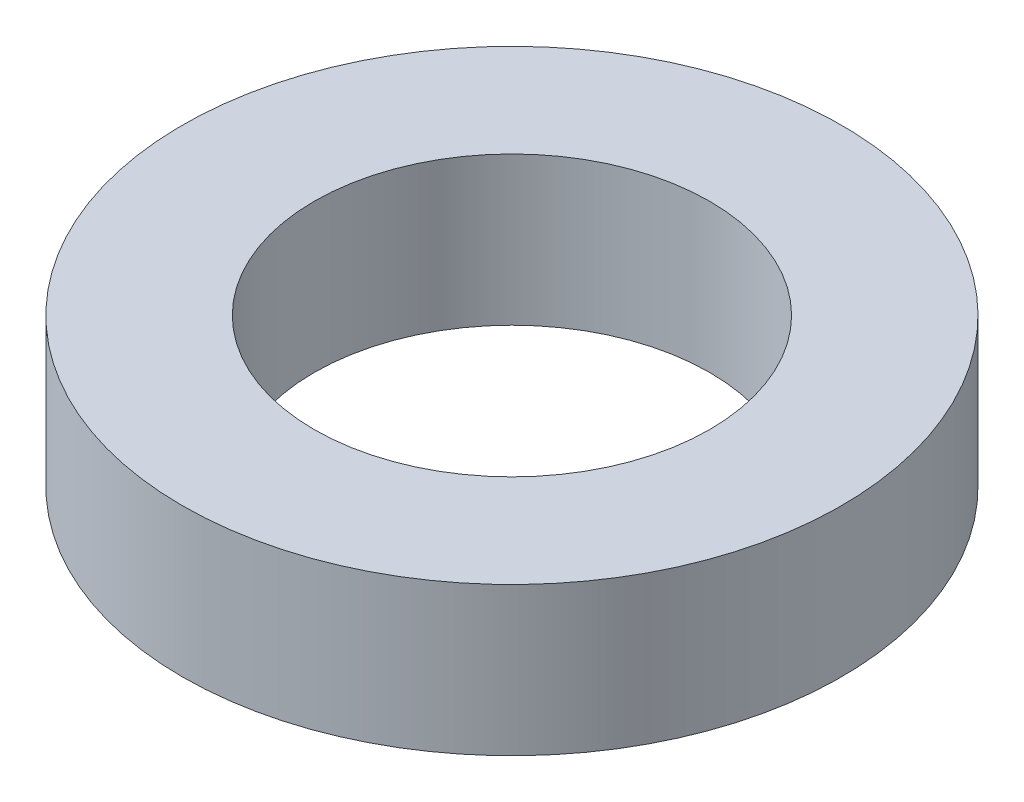
ISO-10303-21;
HEADER;
FILE_DESCRIPTION(('STEP AP214'),'2;1');
FILE_NAME('part.step','',(''),(''),'','','');
FILE_SCHEMA(('AUTOMOTIVE_DESIGN { 1 0 10303 214 1 1 1 1 }'));
ENDSEC;
DATA;
#1=APPLICATION_CONTEXT('core data for automotive mechanical design processes');
#2=APPLICATION_PROTOCOL_DEFINITION('international standard','automotive_design',2000,#1);
#3=PRODUCT_CONTEXT('',#1,'mechanical');
#4=PRODUCT('Part','Part','',(#3));
#5=PRODUCT_RELATED_PRODUCT_CATEGORY('part','',(#4));
#6=PRODUCT_DEFINITION_FORMATION('','',#4);
#7=PRODUCT_DEFINITION_CONTEXT('part definition',#1,'design');
#8=PRODUCT_DEFINITION('design','',#6,#7);
#9=PRODUCT_DEFINITION_SHAPE('','',#8);
#10=(LENGTH_UNIT() NAMED_UNIT(*) SI_UNIT(.MILLI.,.METRE.));
#11=(NAMED_UNIT(*) PLANE_ANGLE_UNIT() SI_UNIT($,.RADIAN.));
#12=(NAMED_UNIT(*) SI_UNIT($,.STERADIAN.) SOLID_ANGLE_UNIT());
#13=UNCERTAINTY_MEASURE_WITH_UNIT(LENGTH_MEASURE(1.E-05),#10,'distance_accuracy_value','');
#14=(GEOMETRIC_REPRESENTATION_CONTEXT(3) GLOBAL_UNCERTAINTY_ASSIGNED_CONTEXT((#13)) GLOBAL_UNIT_ASSIGNED_CONTEXT((#10,
#11,#12)) REPRESENTATION_CONTEXT('',''));
#15=CARTESIAN_POINT('',(0.,0.,0.));
#16=DIRECTION('',(0.,0.,1.));
#17=DIRECTION('',(1.,0.,0.));
#18=AXIS2_PLACEMENT_3D('',#15,#16,#17);
#19=CARTESIAN_POINT('',(0.,4.5,0.));
#20=DIRECTION('',(0.,1.,0.));
#21=DIRECTION('',(0.,0.,1.));
#22=AXIS2_PLACEMENT_3D('',#19,#20,#21);
#23=PLANE('',#22);
#24=CARTESIAN_POINT('',(0.,4.5,0.));
#25=DIRECTION('',(0.,1.,0.));
#26=DIRECTION('',(0.,0.,1.));
#27=AXIS2_PLACEMENT_3D('',#24,#25,#26);
#28=CIRCLE('',#27,10.);
#29=CARTESIAN_POINT('',(0.,4.5,10.));
#30=VERTEX_POINT('',#29);
#31=EDGE_CURVE('E10',#30,#30,#28,.T.);
#32=ORIENTED_EDGE('',*,*,#31,.T.);
#33=EDGE_LOOP('',(#32));
#34=FACE_BOUND('',#33,.T.);
#35=CARTESIAN_POINT('',(0.,4.5,0.));
#36=DIRECTION('',(0.,1.,0.));
#37=DIRECTION('',(0.,0.,1.));
#38=AXIS2_PLACEMENT_3D('',#35,#36,#37);
#39=CIRCLE('',#38,6.);
#40=CARTESIAN_POINT('',(0.,4.5,6.));
#41=VERTEX_POINT('',#40);
#42=EDGE_CURVE('E55',#41,#41,#39,.T.);
#43=ORIENTED_EDGE('',*,*,#42,.F.);
#44=EDGE_LOOP('',(#43));
#45=FACE_BOUND('',#44,.T.);
#46=ADVANCED_FACE('F41',(#34,#45),#23,.T.);
#47=CARTESIAN_POINT('',(0.,0.,0.));
#48=DIRECTION('',(0.,1.,0.));
#49=DIRECTION('',(0.,0.,1.));
#50=AXIS2_PLACEMENT_3D('',#47,#48,#49);
#51=PLANE('',#50);
#52=CARTESIAN_POINT('',(0.,0.,0.));
#53=DIRECTION('',(0.,1.,0.));
#54=DIRECTION('',(0.,0.,1.));
#55=AXIS2_PLACEMENT_3D('',#52,#53,#54);
#56=CIRCLE('',#55,10.);
#57=CARTESIAN_POINT('',(0.,0.,10.));
#58=VERTEX_POINT('',#57);
#59=EDGE_CURVE('E45',#58,#58,#56,.T.);
#60=ORIENTED_EDGE('',*,*,#59,.F.);
#61=EDGE_LOOP('',(#60));
#62=FACE_BOUND('',#61,.T.);
#63=CARTESIAN_POINT('',(0.,0.,0.));
#64=DIRECTION('',(0.,1.,0.));
#65=DIRECTION('',(0.,0.,1.));
#66=AXIS2_PLACEMENT_3D('',#63,#64,#65);
#67=CIRCLE('',#66,6.);
#68=CARTESIAN_POINT('',(0.,0.,6.));
#69=VERTEX_POINT('',#68);
#70=EDGE_CURVE('E57',#69,#69,#67,.T.);
#71=ORIENTED_EDGE('',*,*,#70,.T.);
#72=EDGE_LOOP('',(#71));
#73=FACE_BOUND('',#72,.T.);
#74=ADVANCED_FACE('F70',(#62,#73),#51,.F.);
#75=CARTESIAN_POINT('',(0.,4.5,0.));
#76=DIRECTION('',(0.,-1.,0.));
#77=DIRECTION('',(0.,0.,-1.));
#78=AXIS2_PLACEMENT_3D('',#75,#76,#77);
#79=CYLINDRICAL_SURFACE('',#78,10.);
#80=ORIENTED_EDGE('',*,*,#31,.F.);
#81=EDGE_LOOP('',(#80));
#82=FACE_BOUND('',#81,.T.);
#83=ORIENTED_EDGE('',*,*,#59,.T.);
#84=EDGE_LOOP('',(#83));
#85=FACE_BOUND('',#84,.T.);
#86=ADVANCED_FACE('F43',(#82,#85),#79,.T.);
#87=CARTESIAN_POINT('',(0.,4.5,0.));
#88=DIRECTION('',(0.,-1.,0.));
#89=DIRECTION('',(0.,0.,-1.));
#90=AXIS2_PLACEMENT_3D('',#87,#88,#89);
#91=CYLINDRICAL_SURFACE('',#90,6.);
#92=ORIENTED_EDGE('',*,*,#42,.T.);
#93=EDGE_LOOP('',(#92));
#94=FACE_BOUND('',#93,.T.);
#95=ORIENTED_EDGE('',*,*,#70,.F.);
#96=EDGE_LOOP('',(#95));
#97=FACE_BOUND('',#96,.T.);
#98=ADVANCED_FACE('F66',(#94,#97),#91,.F.);
#99=CLOSED_SHELL('',(#46,#74,#86,#98));
#100=MANIFOLD_SOLID_BREP('B2',#99);
#101=ADVANCED_BREP_SHAPE_REPRESENTATION('',(#18,#100),#14);
#102=SHAPE_DEFINITION_REPRESENTATION(#9,#101);
ENDSEC;
END-ISO-10303-21;
